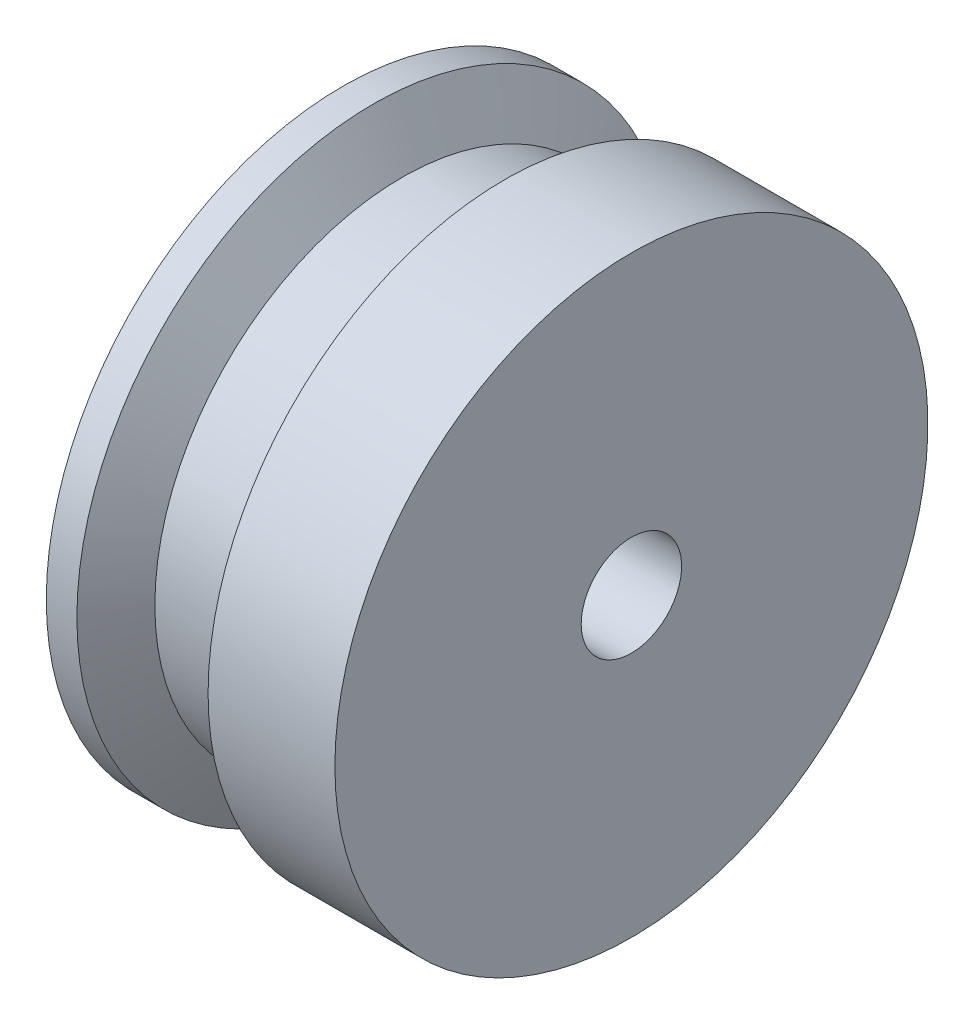
ISO-10303-21;
HEADER;
FILE_DESCRIPTION(('STEP AP214'),'2;1');
FILE_NAME('part.step','',(''),(''),'','','');
FILE_SCHEMA(('AUTOMOTIVE_DESIGN { 1 0 10303 214 1 1 1 1 }'));
ENDSEC;
DATA;
#1=APPLICATION_CONTEXT('core data for automotive mechanical design processes');
#2=APPLICATION_PROTOCOL_DEFINITION('international standard','automotive_design',2000,#1);
#3=PRODUCT_CONTEXT('',#1,'mechanical');
#4=PRODUCT('Part','Part','',(#3));
#5=PRODUCT_RELATED_PRODUCT_CATEGORY('part','',(#4));
#6=PRODUCT_DEFINITION_FORMATION('','',#4);
#7=PRODUCT_DEFINITION_CONTEXT('part definition',#1,'design');
#8=PRODUCT_DEFINITION('design','',#6,#7);
#9=PRODUCT_DEFINITION_SHAPE('','',#8);
#10=(LENGTH_UNIT() NAMED_UNIT(*) SI_UNIT(.MILLI.,.METRE.));
#11=(NAMED_UNIT(*) PLANE_ANGLE_UNIT() SI_UNIT($,.RADIAN.));
#12=(NAMED_UNIT(*) SI_UNIT($,.STERADIAN.) SOLID_ANGLE_UNIT());
#13=UNCERTAINTY_MEASURE_WITH_UNIT(LENGTH_MEASURE(1.E-05),#10,'distance_accuracy_value','');
#14=(GEOMETRIC_REPRESENTATION_CONTEXT(3) GLOBAL_UNCERTAINTY_ASSIGNED_CONTEXT((#13)) GLOBAL_UNIT_ASSIGNED_CONTEXT((#10,
#11,#12)) REPRESENTATION_CONTEXT('',''));
#15=CARTESIAN_POINT('',(0.,0.,0.));
#16=DIRECTION('',(0.,0.,1.));
#17=DIRECTION('',(1.,0.,0.));
#18=AXIS2_PLACEMENT_3D('',#15,#16,#17);
#19=CARTESIAN_POINT('',(18.542,3.2258,0.));
#20=DIRECTION('',(-1.,0.,0.));
#21=DIRECTION('',(0.,0.,1.));
#22=AXIS2_PLACEMENT_3D('',#19,#20,#21);
#23=PLANE('',#22);
#24=CARTESIAN_POINT('',(18.542,0.,0.));
#25=DIRECTION('',(-1.,0.,0.));
#26=DIRECTION('',(0.,0.,1.));
#27=AXIS2_PLACEMENT_3D('',#24,#25,#26);
#28=CIRCLE('',#27,19.05);
#29=CARTESIAN_POINT('',(18.542,0.,19.05));
#30=VERTEX_POINT('',#29);
#31=EDGE_CURVE('E12',#30,#30,#28,.T.);
#32=ORIENTED_EDGE('',*,*,#31,.F.);
#33=EDGE_LOOP('',(#32));
#34=FACE_BOUND('',#33,.T.);
#35=CARTESIAN_POINT('',(18.542,0.,0.));
#36=DIRECTION('',(-1.,0.,0.));
#37=DIRECTION('',(0.,0.,1.));
#38=AXIS2_PLACEMENT_3D('',#35,#36,#37);
#39=CIRCLE('',#38,3.2258);
#40=CARTESIAN_POINT('',(18.542,0.,3.2258));
#41=VERTEX_POINT('',#40);
#42=EDGE_CURVE('E72',#41,#41,#39,.T.);
#43=ORIENTED_EDGE('',*,*,#42,.T.);
#44=EDGE_LOOP('',(#43));
#45=FACE_BOUND('',#44,.T.);
#46=ADVANCED_FACE('F44',(#34,#45),#23,.F.);
#47=CARTESIAN_POINT('',(0.,0.,0.));
#48=DIRECTION('',(-1.,0.,0.));
#49=DIRECTION('',(0.,0.,1.));
#50=AXIS2_PLACEMENT_3D('',#47,#48,#49);
#51=CYLINDRICAL_SURFACE('',#50,19.05);
#52=CARTESIAN_POINT('',(10.3950037713437,0.,0.));
#53=DIRECTION('',(-1.,0.,0.));
#54=DIRECTION('',(0.,0.,1.));
#55=AXIS2_PLACEMENT_3D('',#52,#53,#54);
#56=CIRCLE('',#55,19.05);
#57=CARTESIAN_POINT('',(10.3950037713437,0.,19.05));
#58=VERTEX_POINT('',#57);
#59=EDGE_CURVE('E50',#58,#58,#56,.T.);
#60=ORIENTED_EDGE('',*,*,#59,.F.);
#61=EDGE_LOOP('',(#60));
#62=FACE_BOUND('',#61,.T.);
#63=ORIENTED_EDGE('',*,*,#31,.T.);
#64=EDGE_LOOP('',(#63));
#65=FACE_BOUND('',#64,.T.);
#66=ADVANCED_FACE('F109',(#62,#65),#51,.T.);
#67=CARTESIAN_POINT('',(10.3950037713437,0.,0.));
#68=DIRECTION('',(1.,0.,0.));
#69=DIRECTION('',(0.,0.,-1.));
#70=AXIS2_PLACEMENT_3D('',#67,#68,#69);
#71=CONICAL_SURFACE('',#70,19.05,1.0471975511966);
#72=CARTESIAN_POINT('',(8.56191666666667,0.,0.));
#73=DIRECTION('',(-1.,0.,0.));
#74=DIRECTION('',(0.,0.,1.));
#75=AXIS2_PLACEMENT_3D('',#72,#73,#74);
#76=CIRCLE('',#75,15.875);
#77=CARTESIAN_POINT('',(8.56191666666667,0.,15.875));
#78=VERTEX_POINT('',#77);
#79=EDGE_CURVE('E54',#78,#78,#76,.T.);
#80=ORIENTED_EDGE('',*,*,#79,.F.);
#81=EDGE_LOOP('',(#80));
#82=FACE_BOUND('',#81,.T.);
#83=ORIENTED_EDGE('',*,*,#59,.T.);
#84=EDGE_LOOP('',(#83));
#85=FACE_BOUND('',#84,.T.);
#86=ADVANCED_FACE('F104',(#82,#85),#71,.T.);
#87=CARTESIAN_POINT('',(0.,0.,0.));
#88=DIRECTION('',(-1.,0.,0.));
#89=DIRECTION('',(0.,0.,1.));
#90=AXIS2_PLACEMENT_3D('',#87,#88,#89);
#91=CYLINDRICAL_SURFACE('',#90,15.875);
#92=CARTESIAN_POINT('',(3.79941666666667,0.,0.));
#93=DIRECTION('',(-1.,0.,0.));
#94=DIRECTION('',(0.,0.,1.));
#95=AXIS2_PLACEMENT_3D('',#92,#93,#94);
#96=CIRCLE('',#95,15.875);
#97=CARTESIAN_POINT('',(3.79941666666667,0.,15.875));
#98=VERTEX_POINT('',#97);
#99=EDGE_CURVE('E58',#98,#98,#96,.T.);
#100=ORIENTED_EDGE('',*,*,#99,.F.);
#101=EDGE_LOOP('',(#100));
#102=FACE_BOUND('',#101,.T.);
#103=ORIENTED_EDGE('',*,*,#79,.T.);
#104=EDGE_LOOP('',(#103));
#105=FACE_BOUND('',#104,.T.);
#106=ADVANCED_FACE('F98',(#102,#105),#91,.T.);
#107=CARTESIAN_POINT('',(3.79941666666667,0.,0.));
#108=DIRECTION('',(-1.,0.,0.));
#109=DIRECTION('',(0.,0.,1.));
#110=AXIS2_PLACEMENT_3D('',#107,#108,#109);
#111=CONICAL_SURFACE('',#110,15.875,1.0471975511966);
#112=CARTESIAN_POINT('',(1.96632956198961,0.,0.));
#113=DIRECTION('',(-1.,0.,0.));
#114=DIRECTION('',(0.,0.,1.));
#115=AXIS2_PLACEMENT_3D('',#112,#113,#114);
#116=CIRCLE('',#115,19.05);
#117=CARTESIAN_POINT('',(1.96632956198961,0.,19.05));
#118=VERTEX_POINT('',#117);
#119=EDGE_CURVE('E63',#118,#118,#116,.T.);
#120=ORIENTED_EDGE('',*,*,#119,.F.);
#121=EDGE_LOOP('',(#120));
#122=FACE_BOUND('',#121,.T.);
#123=ORIENTED_EDGE('',*,*,#99,.T.);
#124=EDGE_LOOP('',(#123));
#125=FACE_BOUND('',#124,.T.);
#126=ADVANCED_FACE('F92',(#122,#125),#111,.T.);
#127=CARTESIAN_POINT('',(0.,0.,0.));
#128=DIRECTION('',(-1.,0.,0.));
#129=DIRECTION('',(0.,0.,1.));
#130=AXIS2_PLACEMENT_3D('',#127,#128,#129);
#131=CYLINDRICAL_SURFACE('',#130,19.05);
#132=CARTESIAN_POINT('',(0.,0.,0.));
#133=DIRECTION('',(-1.,0.,0.));
#134=DIRECTION('',(0.,0.,1.));
#135=AXIS2_PLACEMENT_3D('',#132,#133,#134);
#136=CIRCLE('',#135,19.05);
#137=CARTESIAN_POINT('',(0.,0.,19.05));
#138=VERTEX_POINT('',#137);
#139=EDGE_CURVE('E66',#138,#138,#136,.T.);
#140=ORIENTED_EDGE('',*,*,#139,.F.);
#141=EDGE_LOOP('',(#140));
#142=FACE_BOUND('',#141,.T.);
#143=ORIENTED_EDGE('',*,*,#119,.T.);
#144=EDGE_LOOP('',(#143));
#145=FACE_BOUND('',#144,.T.);
#146=ADVANCED_FACE('F86',(#142,#145),#131,.T.);
#147=CARTESIAN_POINT('',(0.,19.05,0.));
#148=DIRECTION('',(1.,0.,0.));
#149=DIRECTION('',(0.,0.,-1.));
#150=AXIS2_PLACEMENT_3D('',#147,#148,#149);
#151=PLANE('',#150);
#152=CARTESIAN_POINT('',(0.,0.,0.));
#153=DIRECTION('',(-1.,0.,0.));
#154=DIRECTION('',(0.,0.,1.));
#155=AXIS2_PLACEMENT_3D('',#152,#153,#154);
#156=CIRCLE('',#155,3.2258);
#157=CARTESIAN_POINT('',(0.,0.,3.2258));
#158=VERTEX_POINT('',#157);
#159=EDGE_CURVE('E69',#158,#158,#156,.T.);
#160=ORIENTED_EDGE('',*,*,#159,.F.);
#161=EDGE_LOOP('',(#160));
#162=FACE_BOUND('',#161,.T.);
#163=ORIENTED_EDGE('',*,*,#139,.T.);
#164=EDGE_LOOP('',(#163));
#165=FACE_BOUND('',#164,.T.);
#166=ADVANCED_FACE('F80',(#162,#165),#151,.F.);
#167=CARTESIAN_POINT('',(0.,0.,0.));
#168=DIRECTION('',(-1.,0.,0.));
#169=DIRECTION('',(0.,0.,1.));
#170=AXIS2_PLACEMENT_3D('',#167,#168,#169);
#171=CYLINDRICAL_SURFACE('',#170,3.2258);
#172=ORIENTED_EDGE('',*,*,#42,.F.);
#173=EDGE_LOOP('',(#172));
#174=FACE_BOUND('',#173,.T.);
#175=ORIENTED_EDGE('',*,*,#159,.T.);
#176=EDGE_LOOP('',(#175));
#177=FACE_BOUND('',#176,.T.);
#178=ADVANCED_FACE('F77',(#174,#177),#171,.F.);
#179=CLOSED_SHELL('',(#46,#66,#86,#106,#126,#146,#166,#178));
#180=MANIFOLD_SOLID_BREP('B2',#179);
#181=ADVANCED_BREP_SHAPE_REPRESENTATION('',(#18,#180),#14);
#182=SHAPE_DEFINITION_REPRESENTATION(#9,#181);
ENDSEC;
END-ISO-10303-21;
